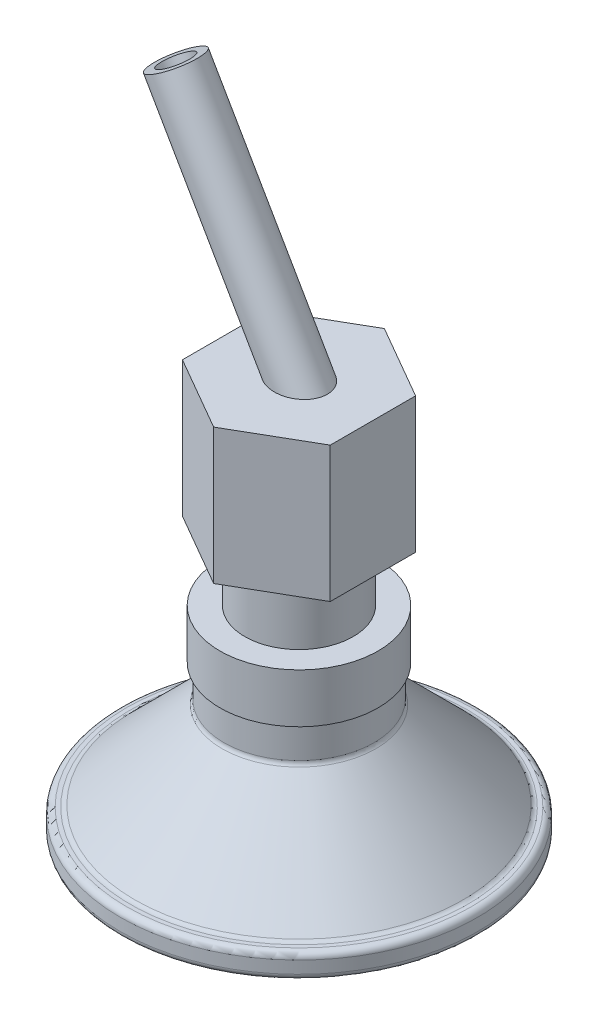
ISO-10303-21;
HEADER;
FILE_DESCRIPTION(('STEP AP214'),'2;1');
FILE_NAME('part.step','',(''),(''),'','','');
FILE_SCHEMA(('AUTOMOTIVE_DESIGN { 1 0 10303 214 1 1 1 1 }'));
ENDSEC;
DATA;
#1=APPLICATION_CONTEXT('core data for automotive mechanical design processes');
#2=APPLICATION_PROTOCOL_DEFINITION('international standard','automotive_design',2000,#1);
#3=PRODUCT_CONTEXT('',#1,'mechanical');
#4=PRODUCT('Part','Part','',(#3));
#5=PRODUCT_RELATED_PRODUCT_CATEGORY('part','',(#4));
#6=PRODUCT_DEFINITION_FORMATION('','',#4);
#7=PRODUCT_DEFINITION_CONTEXT('part definition',#1,'design');
#8=PRODUCT_DEFINITION('design','',#6,#7);
#9=PRODUCT_DEFINITION_SHAPE('','',#8);
#10=(LENGTH_UNIT() NAMED_UNIT(*) SI_UNIT(.MILLI.,.METRE.));
#11=(NAMED_UNIT(*) PLANE_ANGLE_UNIT() SI_UNIT($,.RADIAN.));
#12=(NAMED_UNIT(*) SI_UNIT($,.STERADIAN.) SOLID_ANGLE_UNIT());
#13=UNCERTAINTY_MEASURE_WITH_UNIT(LENGTH_MEASURE(1.E-05),#10,'distance_accuracy_value','');
#14=(GEOMETRIC_REPRESENTATION_CONTEXT(3) GLOBAL_UNCERTAINTY_ASSIGNED_CONTEXT((#13)) GLOBAL_UNIT_ASSIGNED_CONTEXT((#10,
#11,#12)) REPRESENTATION_CONTEXT('',''));
#15=CARTESIAN_POINT('',(0.,0.,0.));
#16=DIRECTION('',(0.,0.,1.));
#17=DIRECTION('',(1.,0.,0.));
#18=AXIS2_PLACEMENT_3D('',#15,#16,#17);
#19=CARTESIAN_POINT('',(1.49999999999998,18.5545163812393,0.));
#20=DIRECTION('',(-0.500000000000004,0.866025403784436,0.));
#21=DIRECTION('',(-0.866025403784436,-0.500000000000004,0.));
#22=AXIS2_PLACEMENT_3D('',#19,#20,#21);
#23=CYLINDRICAL_SURFACE('',#22,2.);
#24=CARTESIAN_POINT('',(1.49999999999998,18.5545163812393,0.));
#25=DIRECTION('',(-0.500000000000004,0.866025403784436,0.));
#26=DIRECTION('',(-0.866025403784436,-0.500000000000004,0.));
#27=AXIS2_PLACEMENT_3D('',#24,#25,#26);
#28=CIRCLE('',#27,2.);
#29=CARTESIAN_POINT('',(-0.232050807568896,17.5545163812393,0.));
#30=VERTEX_POINT('',#29);
#31=EDGE_CURVE('E11',#30,#30,#28,.T.);
#32=ORIENTED_EDGE('',*,*,#31,.T.);
#33=EDGE_LOOP('',(#32));
#34=FACE_BOUND('',#33,.T.);
#35=CARTESIAN_POINT('',(-10.0000000000001,38.4731006682813,0.));
#36=DIRECTION('',(-0.500000000000004,0.866025403784436,0.));
#37=DIRECTION('',(-0.866025403784436,-0.500000000000004,0.));
#38=AXIS2_PLACEMENT_3D('',#35,#36,#37);
#39=CIRCLE('',#38,2.);
#40=CARTESIAN_POINT('',(-11.732050807569,37.4731006682813,0.));
#41=VERTEX_POINT('',#40);
#42=EDGE_CURVE('E51',#41,#41,#39,.T.);
#43=ORIENTED_EDGE('',*,*,#42,.F.);
#44=EDGE_LOOP('',(#43));
#45=FACE_BOUND('',#44,.T.);
#46=ADVANCED_FACE('F41',(#34,#45),#23,.T.);
#47=CARTESIAN_POINT('',(1.49999999999998,18.5545163812393,0.));
#48=DIRECTION('',(-0.500000000000004,0.866025403784436,0.));
#49=DIRECTION('',(-0.866025403784436,-0.500000000000004,0.));
#50=AXIS2_PLACEMENT_3D('',#47,#48,#49);
#51=PLANE('',#50);
#52=CARTESIAN_POINT('',(1.49999999999998,18.5545163812393,0.));
#53=DIRECTION('',(-0.500000000000004,0.866025403784436,0.));
#54=DIRECTION('',(-0.866025403784436,-0.500000000000004,0.));
#55=AXIS2_PLACEMENT_3D('',#52,#53,#54);
#56=CIRCLE('',#55,1.3);
#57=CARTESIAN_POINT('',(0.37416697508021,17.9045163812393,0.));
#58=VERTEX_POINT('',#57);
#59=EDGE_CURVE('E47',#58,#58,#56,.T.);
#60=ORIENTED_EDGE('',*,*,#59,.T.);
#61=EDGE_LOOP('',(#60));
#62=FACE_BOUND('',#61,.T.);
#63=ORIENTED_EDGE('',*,*,#31,.F.);
#64=EDGE_LOOP('',(#63));
#65=FACE_BOUND('',#64,.T.);
#66=ADVANCED_FACE('F70',(#62,#65),#51,.F.);
#67=CARTESIAN_POINT('',(1.49999999999998,18.5545163812393,0.));
#68=DIRECTION('',(-0.500000000000004,0.866025403784436,0.));
#69=DIRECTION('',(-0.866025403784436,-0.500000000000004,0.));
#70=AXIS2_PLACEMENT_3D('',#67,#68,#69);
#71=CYLINDRICAL_SURFACE('',#70,1.3);
#72=ORIENTED_EDGE('',*,*,#59,.F.);
#73=EDGE_LOOP('',(#72));
#74=FACE_BOUND('',#73,.T.);
#75=CARTESIAN_POINT('',(-10.0000000000001,38.4731006682813,0.));
#76=DIRECTION('',(-0.500000000000004,0.866025403784436,0.));
#77=DIRECTION('',(-0.866025403784436,-0.500000000000004,0.));
#78=AXIS2_PLACEMENT_3D('',#75,#76,#77);
#79=CIRCLE('',#78,1.3);
#80=CARTESIAN_POINT('',(-11.1258330249199,37.8231006682813,0.));
#81=VERTEX_POINT('',#80);
#82=EDGE_CURVE('E55',#81,#81,#79,.T.);
#83=ORIENTED_EDGE('',*,*,#82,.T.);
#84=EDGE_LOOP('',(#83));
#85=FACE_BOUND('',#84,.T.);
#86=ADVANCED_FACE('F61',(#74,#85),#71,.F.);
#87=CARTESIAN_POINT('',(-10.0000000000001,38.4731006682813,0.));
#88=DIRECTION('',(-0.500000000000004,0.866025403784436,0.));
#89=DIRECTION('',(-0.866025403784436,-0.500000000000004,0.));
#90=AXIS2_PLACEMENT_3D('',#87,#88,#89);
#91=PLANE('',#90);
#92=ORIENTED_EDGE('',*,*,#42,.T.);
#93=EDGE_LOOP('',(#92));
#94=FACE_BOUND('',#93,.T.);
#95=ORIENTED_EDGE('',*,*,#82,.F.);
#96=EDGE_LOOP('',(#95));
#97=FACE_BOUND('',#96,.T.);
#98=ADVANCED_FACE('F63',(#94,#97),#91,.T.);
#99=CLOSED_SHELL('',(#46,#66,#86,#98));
#100=MANIFOLD_SOLID_BREP('B2',#99);
#101=CARTESIAN_POINT('',(5.1,1.15259259259259,0.));
#102=DIRECTION('',(0.,-1.,0.));
#103=DIRECTION('',(0.,0.,-1.));
#104=AXIS2_PLACEMENT_3D('',#101,#102,#103);
#105=PLANE('',#104);
#106=CARTESIAN_POINT('',(0.,1.15259259259259,0.));
#107=DIRECTION('',(0.,1.,0.));
#108=DIRECTION('',(0.,0.,1.));
#109=AXIS2_PLACEMENT_3D('',#106,#107,#108);
#110=CIRCLE('',#109,5.1);
#111=CARTESIAN_POINT('',(0.,1.15259259259259,5.1));
#112=VERTEX_POINT('',#111);
#113=EDGE_CURVE('E158',#112,#112,#110,.T.);
#114=ORIENTED_EDGE('',*,*,#113,.F.);
#115=EDGE_LOOP('',(#114));
#116=FACE_BOUND('',#115,.T.);
#117=CARTESIAN_POINT('',(0.,1.15259259259259,0.));
#118=DIRECTION('',(0.,1.,0.));
#119=DIRECTION('',(0.,0.,1.));
#120=AXIS2_PLACEMENT_3D('',#117,#118,#119);
#121=CIRCLE('',#120,6.1);
#122=CARTESIAN_POINT('',(0.,1.15259259259259,6.1));
#123=VERTEX_POINT('',#122);
#124=EDGE_CURVE('E143',#123,#123,#121,.T.);
#125=ORIENTED_EDGE('',*,*,#124,.T.);
#126=EDGE_LOOP('',(#125));
#127=FACE_BOUND('',#126,.T.);
#128=ADVANCED_FACE('F111',(#116,#127),#105,.F.);
#129=CARTESIAN_POINT('',(0.,10.1525925925926,0.));
#130=DIRECTION('',(0.,1.,0.));
#131=DIRECTION('',(0.,0.,1.));
#132=AXIS2_PLACEMENT_3D('',#129,#130,#131);
#133=CYLINDRICAL_SURFACE('',#132,6.1);
#134=CARTESIAN_POINT('',(0.,-1.45244442794756,0.));
#135=DIRECTION('',(0.,1.,0.));
#136=DIRECTION('',(0.,0.,1.));
#137=AXIS2_PLACEMENT_3D('',#134,#135,#136);
#138=CIRCLE('',#137,6.1);
#139=CARTESIAN_POINT('',(0.,-1.45244442794756,6.1));
#140=VERTEX_POINT('',#139);
#141=EDGE_CURVE('E126',#140,#140,#138,.T.);
#142=ORIENTED_EDGE('',*,*,#141,.T.);
#143=EDGE_LOOP('',(#142));
#144=FACE_BOUND('',#143,.T.);
#145=ORIENTED_EDGE('',*,*,#124,.F.);
#146=EDGE_LOOP('',(#145));
#147=FACE_BOUND('',#146,.T.);
#148=ADVANCED_FACE('F166',(#144,#147),#133,.T.);
#149=CARTESIAN_POINT('',(0.,-9.0358179512275,0.));
#150=DIRECTION('',(0.,-1.,0.));
#151=DIRECTION('',(0.,0.,-1.));
#152=AXIS2_PLACEMENT_3D('',#149,#150,#151);
#153=CONICAL_SURFACE('',#152,13.4762667420934,0.785398163397448);
#154=CARTESIAN_POINT('',(0.,-8.88937134182077,0.));
#155=DIRECTION('',(0.,-1.,0.));
#156=DIRECTION('',(0.,0.,-1.));
#157=AXIS2_PLACEMENT_3D('',#154,#155,#156);
#158=CIRCLE('',#157,13.3298201326867);
#159=CARTESIAN_POINT('',(0.,-8.88937134182077,-13.3298201326867));
#160=VERTEX_POINT('',#159);
#161=EDGE_CURVE('E137',#160,#160,#158,.F.);
#162=ORIENTED_EDGE('',*,*,#161,.T.);
#163=EDGE_LOOP('',(#162));
#164=FACE_BOUND('',#163,.T.);
#165=CARTESIAN_POINT('',(0.,-1.80599781854084,0.));
#166=DIRECTION('',(0.,-1.,0.));
#167=DIRECTION('',(0.,0.,-1.));
#168=AXIS2_PLACEMENT_3D('',#165,#166,#167);
#169=CIRCLE('',#168,6.24644660940673);
#170=CARTESIAN_POINT('',(0.,-1.80599781854084,-6.24644660940673));
#171=VERTEX_POINT('',#170);
#172=EDGE_CURVE('E140',#171,#171,#169,.T.);
#173=ORIENTED_EDGE('',*,*,#172,.T.);
#174=EDGE_LOOP('',(#173));
#175=FACE_BOUND('',#174,.T.);
#176=ADVANCED_FACE('F171',(#164,#175),#153,.T.);
#177=CARTESIAN_POINT('',(13.4762667420934,-9.03581795122749,0.));
#178=DIRECTION('',(0.,-1.,0.));
#179=DIRECTION('',(0.,0.,-1.));
#180=AXIS2_PLACEMENT_3D('',#177,#178,#179);
#181=PLANE('',#180);
#182=CARTESIAN_POINT('',(0.,-9.03581795122749,0.));
#183=DIRECTION('',(0.,-1.,0.));
#184=DIRECTION('',(0.,0.,-1.));
#185=AXIS2_PLACEMENT_3D('',#182,#183,#184);
#186=CIRCLE('',#185,13.6833735232799);
#187=CARTESIAN_POINT('',(0.,-9.03581795122749,-13.6833735232799));
#188=VERTEX_POINT('',#187);
#189=EDGE_CURVE('E131',#188,#188,#186,.T.);
#190=ORIENTED_EDGE('',*,*,#189,.T.);
#191=EDGE_LOOP('',(#190));
#192=FACE_BOUND('',#191,.T.);
#193=CARTESIAN_POINT('',(0.,-9.03581795122749,0.));
#194=DIRECTION('',(0.,-1.,0.));
#195=DIRECTION('',(0.,0.,-1.));
#196=AXIS2_PLACEMENT_3D('',#193,#194,#195);
#197=CIRCLE('',#196,14.000695366395);
#198=CARTESIAN_POINT('',(0.,-9.03581795122749,-14.000695366395));
#199=VERTEX_POINT('',#198);
#200=EDGE_CURVE('E134',#199,#199,#197,.F.);
#201=ORIENTED_EDGE('',*,*,#200,.T.);
#202=EDGE_LOOP('',(#201));
#203=FACE_BOUND('',#202,.T.);
#204=ADVANCED_FACE('F177',(#192,#203),#181,.F.);
#205=CARTESIAN_POINT('',(0.,10.1525925925926,0.));
#206=DIRECTION('',(0.,1.,0.));
#207=DIRECTION('',(0.,0.,1.));
#208=AXIS2_PLACEMENT_3D('',#205,#206,#207);
#209=CYLINDRICAL_SURFACE('',#208,14.500695366395);
#210=CARTESIAN_POINT('',(0.,-10.5358179512275,0.));
#211=DIRECTION('',(0.,1.,0.));
#212=DIRECTION('',(0.,0.,1.));
#213=AXIS2_PLACEMENT_3D('',#210,#211,#212);
#214=CIRCLE('',#213,14.500695366395);
#215=CARTESIAN_POINT('',(0.,-10.5358179512275,14.500695366395));
#216=VERTEX_POINT('',#215);
#217=EDGE_CURVE('E118',#216,#216,#214,.T.);
#218=ORIENTED_EDGE('',*,*,#217,.T.);
#219=EDGE_LOOP('',(#218));
#220=FACE_BOUND('',#219,.T.);
#221=CARTESIAN_POINT('',(0.,-9.53581795122749,0.));
#222=DIRECTION('',(0.,-1.,0.));
#223=DIRECTION('',(0.,0.,-1.));
#224=AXIS2_PLACEMENT_3D('',#221,#222,#223);
#225=CIRCLE('',#224,14.500695366395);
#226=CARTESIAN_POINT('',(0.,-9.53581795122749,-14.500695366395));
#227=VERTEX_POINT('',#226);
#228=EDGE_CURVE('E122',#227,#227,#225,.T.);
#229=ORIENTED_EDGE('',*,*,#228,.T.);
#230=EDGE_LOOP('',(#229));
#231=FACE_BOUND('',#230,.T.);
#232=ADVANCED_FACE('F204',(#220,#231),#209,.T.);
#233=CARTESIAN_POINT('',(14.500695366395,-11.0358179512275,0.));
#234=DIRECTION('',(0.,1.,0.));
#235=DIRECTION('',(0.,0.,1.));
#236=AXIS2_PLACEMENT_3D('',#233,#234,#235);
#237=PLANE('',#236);
#238=CARTESIAN_POINT('',(0.,-11.0358179512275,0.));
#239=DIRECTION('',(0.,1.,0.));
#240=DIRECTION('',(0.,0.,1.));
#241=AXIS2_PLACEMENT_3D('',#238,#239,#240);
#242=CIRCLE('',#241,14.000695366395);
#243=CARTESIAN_POINT('',(0.,-11.0358179512275,14.000695366395));
#244=VERTEX_POINT('',#243);
#245=EDGE_CURVE('E40',#244,#244,#242,.F.);
#246=ORIENTED_EDGE('',*,*,#245,.T.);
#247=EDGE_LOOP('',(#246));
#248=FACE_BOUND('',#247,.T.);
#249=CARTESIAN_POINT('',(0.,-11.0358179512275,0.));
#250=DIRECTION('',(0.,1.,0.));
#251=DIRECTION('',(0.,0.,1.));
#252=AXIS2_PLACEMENT_3D('',#249,#250,#251);
#253=CIRCLE('',#252,6.59139488632843);
#254=CARTESIAN_POINT('',(0.,-11.0358179512275,6.59139488632843));
#255=VERTEX_POINT('',#254);
#256=EDGE_CURVE('E146',#255,#255,#253,.T.);
#257=ORIENTED_EDGE('',*,*,#256,.T.);
#258=EDGE_LOOP('',(#257));
#259=FACE_BOUND('',#258,.T.);
#260=ADVANCED_FACE('F209',(#248,#259),#237,.F.);
#261=CARTESIAN_POINT('',(0.,10.1525925925926,0.));
#262=DIRECTION('',(0.,1.,0.));
#263=DIRECTION('',(0.,0.,1.));
#264=AXIS2_PLACEMENT_3D('',#261,#262,#263);
#265=CYLINDRICAL_SURFACE('',#264,6.59139488632843);
#266=ORIENTED_EDGE('',*,*,#256,.F.);
#267=EDGE_LOOP('',(#266));
#268=FACE_BOUND('',#267,.T.);
#269=CARTESIAN_POINT('',(0.,-9.03581795122749,0.));
#270=DIRECTION('',(0.,1.,0.));
#271=DIRECTION('',(0.,0.,1.));
#272=AXIS2_PLACEMENT_3D('',#269,#270,#271);
#273=CIRCLE('',#272,6.59139488632843);
#274=CARTESIAN_POINT('',(0.,-9.03581795122749,6.59139488632843));
#275=VERTEX_POINT('',#274);
#276=EDGE_CURVE('E149',#275,#275,#273,.T.);
#277=ORIENTED_EDGE('',*,*,#276,.T.);
#278=EDGE_LOOP('',(#277));
#279=FACE_BOUND('',#278,.T.);
#280=ADVANCED_FACE('F214',(#268,#279),#265,.F.);
#281=CARTESIAN_POINT('',(6.59139488632843,-9.03581795122749,0.));
#282=DIRECTION('',(0.,-1.,0.));
#283=DIRECTION('',(0.,0.,-1.));
#284=AXIS2_PLACEMENT_3D('',#281,#282,#283);
#285=PLANE('',#284);
#286=ORIENTED_EDGE('',*,*,#276,.F.);
#287=EDGE_LOOP('',(#286));
#288=FACE_BOUND('',#287,.T.);
#289=CARTESIAN_POINT('',(0.,-9.03581795122749,0.));
#290=DIRECTION('',(0.,1.,0.));
#291=DIRECTION('',(0.,0.,1.));
#292=AXIS2_PLACEMENT_3D('',#289,#290,#291);
#293=CIRCLE('',#292,12.0620531797203);
#294=CARTESIAN_POINT('',(0.,-9.03581795122749,12.0620531797203));
#295=VERTEX_POINT('',#294);
#296=EDGE_CURVE('E152',#295,#295,#293,.T.);
#297=ORIENTED_EDGE('',*,*,#296,.T.);
#298=EDGE_LOOP('',(#297));
#299=FACE_BOUND('',#298,.T.);
#300=ADVANCED_FACE('F217',(#288,#299),#285,.F.);
#301=CARTESIAN_POINT('',(0.,-2.0737647715072,0.));
#302=DIRECTION('',(0.,-1.,0.));
#303=DIRECTION('',(0.,0.,-1.));
#304=AXIS2_PLACEMENT_3D('',#301,#302,#303);
#305=CONICAL_SURFACE('',#304,5.1,0.785398163397448);
#306=ORIENTED_EDGE('',*,*,#296,.F.);
#307=EDGE_LOOP('',(#306));
#308=FACE_BOUND('',#307,.T.);
#309=CARTESIAN_POINT('',(0.,-2.0737647715072,0.));
#310=DIRECTION('',(0.,1.,0.));
#311=DIRECTION('',(0.,0.,1.));
#312=AXIS2_PLACEMENT_3D('',#309,#310,#311);
#313=CIRCLE('',#312,5.1);
#314=CARTESIAN_POINT('',(0.,-2.0737647715072,5.1));
#315=VERTEX_POINT('',#314);
#316=EDGE_CURVE('E155',#315,#315,#313,.T.);
#317=ORIENTED_EDGE('',*,*,#316,.T.);
#318=EDGE_LOOP('',(#317));
#319=FACE_BOUND('',#318,.T.);
#320=ADVANCED_FACE('F221',(#308,#319),#305,.F.);
#321=CARTESIAN_POINT('',(0.,10.1525925925926,0.));
#322=DIRECTION('',(0.,1.,0.));
#323=DIRECTION('',(0.,0.,1.));
#324=AXIS2_PLACEMENT_3D('',#321,#322,#323);
#325=CYLINDRICAL_SURFACE('',#324,5.1);
#326=ORIENTED_EDGE('',*,*,#316,.F.);
#327=EDGE_LOOP('',(#326));
#328=FACE_BOUND('',#327,.T.);
#329=ORIENTED_EDGE('',*,*,#113,.T.);
#330=EDGE_LOOP('',(#329));
#331=FACE_BOUND('',#330,.T.);
#332=ADVANCED_FACE('F162',(#328,#331),#325,.F.);
#333=CARTESIAN_POINT('',(0.,-8.53581795122749,0.));
#334=DIRECTION('',(0.,-1.,0.));
#335=DIRECTION('',(0.,0.,-1.));
#336=AXIS2_PLACEMENT_3D('',#333,#334,#335);
#337=TOROIDAL_SURFACE('',#336,13.6833735232799,0.5);
#338=ORIENTED_EDGE('',*,*,#189,.F.);
#339=EDGE_LOOP('',(#338));
#340=FACE_BOUND('',#339,.T.);
#341=ORIENTED_EDGE('',*,*,#161,.F.);
#342=EDGE_LOOP('',(#341));
#343=FACE_BOUND('',#342,.T.);
#344=ADVANCED_FACE('F182',(#340,#343),#337,.F.);
#345=CARTESIAN_POINT('',(0.,-1.45244442794756,0.));
#346=DIRECTION('',(0.,1.,0.));
#347=DIRECTION('',(0.,0.,1.));
#348=AXIS2_PLACEMENT_3D('',#345,#346,#347);
#349=TOROIDAL_SURFACE('',#348,6.6,0.5);
#350=ORIENTED_EDGE('',*,*,#172,.F.);
#351=EDGE_LOOP('',(#350));
#352=FACE_BOUND('',#351,.T.);
#353=ORIENTED_EDGE('',*,*,#141,.F.);
#354=EDGE_LOOP('',(#353));
#355=FACE_BOUND('',#354,.T.);
#356=ADVANCED_FACE('F185',(#352,#355),#349,.F.);
#357=CARTESIAN_POINT('',(0.,-10.5358179512275,0.));
#358=DIRECTION('',(0.,1.,0.));
#359=DIRECTION('',(0.,0.,1.));
#360=AXIS2_PLACEMENT_3D('',#357,#358,#359);
#361=TOROIDAL_SURFACE('',#360,14.000695366395,0.5);
#362=ORIENTED_EDGE('',*,*,#245,.F.);
#363=EDGE_LOOP('',(#362));
#364=FACE_BOUND('',#363,.T.);
#365=ORIENTED_EDGE('',*,*,#217,.F.);
#366=EDGE_LOOP('',(#365));
#367=FACE_BOUND('',#366,.T.);
#368=ADVANCED_FACE('F188',(#364,#367),#361,.T.);
#369=CARTESIAN_POINT('',(0.,-9.53581795122749,0.));
#370=DIRECTION('',(0.,-1.,0.));
#371=DIRECTION('',(0.,0.,-1.));
#372=AXIS2_PLACEMENT_3D('',#369,#370,#371);
#373=TOROIDAL_SURFACE('',#372,14.000695366395,0.5);
#374=ORIENTED_EDGE('',*,*,#228,.F.);
#375=EDGE_LOOP('',(#374));
#376=FACE_BOUND('',#375,.T.);
#377=ORIENTED_EDGE('',*,*,#200,.F.);
#378=EDGE_LOOP('',(#377));
#379=FACE_BOUND('',#378,.T.);
#380=ADVANCED_FACE('F113',(#376,#379),#373,.T.);
#381=CLOSED_SHELL('',(#128,#148,#176,#204,#232,#260,#280,#300,#320,#332,#344,#356,#368,#380));
#382=MANIFOLD_SOLID_BREP('B6',#381);
#383=CARTESIAN_POINT('',(0.,1.89851851851856,0.));
#384=DIRECTION('',(0.,-1.,0.));
#385=DIRECTION('',(0.,0.,-1.));
#386=AXIS2_PLACEMENT_3D('',#383,#384,#385);
#387=CYLINDRICAL_SURFACE('',#386,2.);
#388=CARTESIAN_POINT('',(0.,1.15259259259258,0.));
#389=DIRECTION('',(0.,-1.,0.));
#390=DIRECTION('',(0.,0.,-1.));
#391=AXIS2_PLACEMENT_3D('',#388,#389,#390);
#392=CIRCLE('',#391,2.);
#393=CARTESIAN_POINT('',(0.,1.15259259259258,-2.));
#394=VERTEX_POINT('',#393);
#395=EDGE_CURVE('E109',#394,#394,#392,.T.);
#396=ORIENTED_EDGE('',*,*,#395,.T.);
#397=EDGE_LOOP('',(#396));
#398=FACE_BOUND('',#397,.T.);
#399=CARTESIAN_POINT('',(0.,21.1525925925926,0.));
#400=DIRECTION('',(0.,1.,0.));
#401=DIRECTION('',(0.,0.,1.));
#402=AXIS2_PLACEMENT_3D('',#399,#400,#401);
#403=CIRCLE('',#402,2.);
#404=CARTESIAN_POINT('',(0.,21.1525925925926,2.));
#405=VERTEX_POINT('',#404);
#406=EDGE_CURVE('E412',#405,#405,#403,.T.);
#407=ORIENTED_EDGE('',*,*,#406,.T.);
#408=EDGE_LOOP('',(#407));
#409=FACE_BOUND('',#408,.T.);
#410=ADVANCED_FACE('F322',(#398,#409),#387,.F.);
#411=CARTESIAN_POINT('',(6.42074074074074,1.15259259259258,0.));
#412=DIRECTION('',(0.,-1.,0.));
#413=DIRECTION('',(0.,0.,-1.));
#414=AXIS2_PLACEMENT_3D('',#411,#412,#413);
#415=PLANE('',#414);
#416=CARTESIAN_POINT('',(0.,1.15259259259258,0.));
#417=DIRECTION('',(0.,-1.,0.));
#418=DIRECTION('',(0.,0.,-1.));
#419=AXIS2_PLACEMENT_3D('',#416,#417,#418);
#420=CIRCLE('',#419,6.42074074074074);
#421=CARTESIAN_POINT('',(0.,1.15259259259258,-6.42074074074074));
#422=VERTEX_POINT('',#421);
#423=EDGE_CURVE('E330',#422,#422,#420,.T.);
#424=ORIENTED_EDGE('',*,*,#423,.T.);
#425=EDGE_LOOP('',(#424));
#426=FACE_BOUND('',#425,.T.);
#427=ORIENTED_EDGE('',*,*,#395,.F.);
#428=EDGE_LOOP('',(#427));
#429=FACE_BOUND('',#428,.T.);
#430=ADVANCED_FACE('F439',(#426,#429),#415,.T.);
#431=CARTESIAN_POINT('',(0.,1.89851851851856,0.));
#432=DIRECTION('',(0.,-1.,0.));
#433=DIRECTION('',(0.,0.,-1.));
#434=AXIS2_PLACEMENT_3D('',#431,#432,#433);
#435=CYLINDRICAL_SURFACE('',#434,6.42074074074074);
#436=CARTESIAN_POINT('',(0.,5.15259259259258,0.));
#437=DIRECTION('',(0.,-1.,0.));
#438=DIRECTION('',(0.,0.,-1.));
#439=AXIS2_PLACEMENT_3D('',#436,#437,#438);
#440=CIRCLE('',#439,6.42074074074074);
#441=CARTESIAN_POINT('',(0.,5.15259259259258,-6.42074074074074));
#442=VERTEX_POINT('',#441);
#443=EDGE_CURVE('E434',#442,#442,#440,.T.);
#444=ORIENTED_EDGE('',*,*,#443,.T.);
#445=EDGE_LOOP('',(#444));
#446=FACE_BOUND('',#445,.T.);
#447=ORIENTED_EDGE('',*,*,#423,.F.);
#448=EDGE_LOOP('',(#447));
#449=FACE_BOUND('',#448,.T.);
#450=ADVANCED_FACE('F442',(#446,#449),#435,.T.);
#451=CARTESIAN_POINT('',(4.4,5.15259259259258,0.));
#452=DIRECTION('',(0.,1.,0.));
#453=DIRECTION('',(0.,0.,1.));
#454=AXIS2_PLACEMENT_3D('',#451,#452,#453);
#455=PLANE('',#454);
#456=CARTESIAN_POINT('',(0.,5.15259259259258,0.));
#457=DIRECTION('',(0.,-1.,0.));
#458=DIRECTION('',(0.,0.,-1.));
#459=AXIS2_PLACEMENT_3D('',#456,#457,#458);
#460=CIRCLE('',#459,4.4);
#461=CARTESIAN_POINT('',(0.,5.15259259259258,-4.4));
#462=VERTEX_POINT('',#461);
#463=EDGE_CURVE('E431',#462,#462,#460,.T.);
#464=ORIENTED_EDGE('',*,*,#463,.T.);
#465=EDGE_LOOP('',(#464));
#466=FACE_BOUND('',#465,.T.);
#467=ORIENTED_EDGE('',*,*,#443,.F.);
#468=EDGE_LOOP('',(#467));
#469=FACE_BOUND('',#468,.T.);
#470=ADVANCED_FACE('F444',(#466,#469),#455,.T.);
#471=CARTESIAN_POINT('',(0.,1.89851851851856,0.));
#472=DIRECTION('',(0.,-1.,0.));
#473=DIRECTION('',(0.,0.,-1.));
#474=AXIS2_PLACEMENT_3D('',#471,#472,#473);
#475=CYLINDRICAL_SURFACE('',#474,4.4);
#476=CARTESIAN_POINT('',(0.,10.1525925925926,0.));
#477=DIRECTION('',(0.,-1.,0.));
#478=DIRECTION('',(0.,0.,-1.));
#479=AXIS2_PLACEMENT_3D('',#476,#477,#478);
#480=CIRCLE('',#479,4.4);
#481=CARTESIAN_POINT('',(0.,10.1525925925926,-4.4));
#482=VERTEX_POINT('',#481);
#483=EDGE_CURVE('E428',#482,#482,#480,.T.);
#484=ORIENTED_EDGE('',*,*,#483,.T.);
#485=EDGE_LOOP('',(#484));
#486=FACE_BOUND('',#485,.T.);
#487=ORIENTED_EDGE('',*,*,#463,.F.);
#488=EDGE_LOOP('',(#487));
#489=FACE_BOUND('',#488,.T.);
#490=ADVANCED_FACE('F451',(#486,#489),#475,.T.);
#491=CARTESIAN_POINT('',(0.,21.1525925925926,0.));
#492=DIRECTION('',(0.,1.,0.));
#493=DIRECTION('',(0.,0.,1.));
#494=AXIS2_PLACEMENT_3D('',#491,#492,#493);
#495=PLANE('',#494);
#496=DIRECTION('',(0.,0.,-1.));
#497=VECTOR('',#496,1.);
#498=CARTESIAN_POINT('',(5.99999999999998,21.1525925925926,3.46410161513779));
#499=LINE('',#498,#497);
#500=CARTESIAN_POINT('',(5.99999999999998,21.1525925925926,3.46410161513779));
#501=VERTEX_POINT('',#500);
#502=CARTESIAN_POINT('',(6.00000000000002,21.1525925925926,-3.46410161513772));
#503=VERTEX_POINT('',#502);
#504=EDGE_CURVE('E419',#501,#503,#499,.T.);
#505=ORIENTED_EDGE('',*,*,#504,.T.);
#506=DIRECTION('',(-0.866025403784436,0.,-0.500000000000005));
#507=VECTOR('',#506,1.);
#508=CARTESIAN_POINT('',(6.00000000000002,21.1525925925926,-3.46410161513772));
#509=LINE('',#508,#507);
#510=CARTESIAN_POINT('',(0.,21.1525925925926,-6.92820323027551));
#511=VERTEX_POINT('',#510);
#512=EDGE_CURVE('E376',#503,#511,#509,.T.);
#513=ORIENTED_EDGE('',*,*,#512,.T.);
#514=DIRECTION('',(-0.866025403784442,0.,0.499999999999995));
#515=VECTOR('',#514,1.);
#516=CARTESIAN_POINT('',(0.,21.1525925925926,-6.92820323027551));
#517=LINE('',#516,#515);
#518=CARTESIAN_POINT('',(-5.99999999999998,21.1525925925926,-3.46410161513779));
#519=VERTEX_POINT('',#518);
#520=EDGE_CURVE('E390',#511,#519,#517,.T.);
#521=ORIENTED_EDGE('',*,*,#520,.T.);
#522=DIRECTION('',(0.,0.,1.));
#523=VECTOR('',#522,1.);
#524=CARTESIAN_POINT('',(-5.99999999999998,21.1525925925926,-3.46410161513779));
#525=LINE('',#524,#523);
#526=CARTESIAN_POINT('',(-6.00000000000002,21.1525925925926,3.46410161513772));
#527=VERTEX_POINT('',#526);
#528=EDGE_CURVE('E383',#519,#527,#525,.T.);
#529=ORIENTED_EDGE('',*,*,#528,.T.);
#530=DIRECTION('',(0.866025403784436,0.,0.500000000000005));
#531=VECTOR('',#530,1.);
#532=CARTESIAN_POINT('',(-6.00000000000002,21.1525925925926,3.46410161513772));
#533=LINE('',#532,#531);
#534=CARTESIAN_POINT('',(0.,21.1525925925926,6.92820323027551));
#535=VERTEX_POINT('',#534);
#536=EDGE_CURVE('E388',#527,#535,#533,.T.);
#537=ORIENTED_EDGE('',*,*,#536,.T.);
#538=DIRECTION('',(0.866025403784441,0.,-0.499999999999995));
#539=VECTOR('',#538,1.);
#540=CARTESIAN_POINT('',(0.,21.1525925925926,6.92820323027551));
#541=LINE('',#540,#539);
#542=EDGE_CURVE('E338',#535,#501,#541,.T.);
#543=ORIENTED_EDGE('',*,*,#542,.T.);
#544=EDGE_LOOP('',(#505,#513,#521,#529,#537,#543));
#545=FACE_BOUND('',#544,.T.);
#546=ORIENTED_EDGE('',*,*,#406,.F.);
#547=EDGE_LOOP('',(#546));
#548=FACE_BOUND('',#547,.T.);
#549=ADVANCED_FACE('F385',(#545,#548),#495,.T.);
#550=CARTESIAN_POINT('',(0.,10.1525925925926,0.));
#551=DIRECTION('',(0.,1.,0.));
#552=DIRECTION('',(0.,0.,1.));
#553=AXIS2_PLACEMENT_3D('',#550,#551,#552);
#554=PLANE('',#553);
#555=ORIENTED_EDGE('',*,*,#483,.F.);
#556=EDGE_LOOP('',(#555));
#557=FACE_BOUND('',#556,.T.);
#558=DIRECTION('',(0.,0.,-1.));
#559=VECTOR('',#558,1.);
#560=CARTESIAN_POINT('',(5.99999999999998,10.1525925925926,3.46410161513779));
#561=LINE('',#560,#559);
#562=CARTESIAN_POINT('',(5.99999999999998,10.1525925925926,3.46410161513779));
#563=VERTEX_POINT('',#562);
#564=CARTESIAN_POINT('',(6.00000000000002,10.1525925925926,-3.46410161513772));
#565=VERTEX_POINT('',#564);
#566=EDGE_CURVE('E408',#563,#565,#561,.T.);
#567=ORIENTED_EDGE('',*,*,#566,.F.);
#568=DIRECTION('',(0.866025403784441,0.,-0.499999999999995));
#569=VECTOR('',#568,1.);
#570=CARTESIAN_POINT('',(0.,10.1525925925926,6.92820323027551));
#571=LINE('',#570,#569);
#572=CARTESIAN_POINT('',(0.,10.1525925925926,6.92820323027551));
#573=VERTEX_POINT('',#572);
#574=EDGE_CURVE('E367',#573,#563,#571,.T.);
#575=ORIENTED_EDGE('',*,*,#574,.F.);
#576=DIRECTION('',(0.866025403784436,0.,0.500000000000005));
#577=VECTOR('',#576,1.);
#578=CARTESIAN_POINT('',(-6.00000000000002,10.1525925925926,3.46410161513772));
#579=LINE('',#578,#577);
#580=CARTESIAN_POINT('',(-6.00000000000002,10.1525925925926,3.46410161513772));
#581=VERTEX_POINT('',#580);
#582=EDGE_CURVE('E361',#581,#573,#579,.T.);
#583=ORIENTED_EDGE('',*,*,#582,.F.);
#584=DIRECTION('',(0.,0.,1.));
#585=VECTOR('',#584,1.);
#586=CARTESIAN_POINT('',(-5.99999999999998,10.1525925925926,-3.46410161513779));
#587=LINE('',#586,#585);
#588=CARTESIAN_POINT('',(-5.99999999999998,10.1525925925926,-3.46410161513779));
#589=VERTEX_POINT('',#588);
#590=EDGE_CURVE('E398',#589,#581,#587,.T.);
#591=ORIENTED_EDGE('',*,*,#590,.F.);
#592=DIRECTION('',(-0.866025403784442,0.,0.499999999999995));
#593=VECTOR('',#592,1.);
#594=CARTESIAN_POINT('',(0.,10.1525925925926,-6.92820323027551));
#595=LINE('',#594,#593);
#596=CARTESIAN_POINT('',(0.,10.1525925925926,-6.92820323027551));
#597=VERTEX_POINT('',#596);
#598=EDGE_CURVE('E414',#597,#589,#595,.T.);
#599=ORIENTED_EDGE('',*,*,#598,.F.);
#600=DIRECTION('',(-0.866025403784436,0.,-0.500000000000005));
#601=VECTOR('',#600,1.);
#602=CARTESIAN_POINT('',(6.00000000000002,10.1525925925926,-3.46410161513772));
#603=LINE('',#602,#601);
#604=EDGE_CURVE('E411',#565,#597,#603,.T.);
#605=ORIENTED_EDGE('',*,*,#604,.F.);
#606=EDGE_LOOP('',(#567,#575,#583,#591,#599,#605));
#607=FACE_BOUND('',#606,.T.);
#608=ADVANCED_FACE('F473',(#557,#607),#554,.F.);
#609=CARTESIAN_POINT('',(5.99999999999998,21.1525925925926,3.46410161513779));
#610=DIRECTION('',(-1.,0.,0.));
#611=DIRECTION('',(0.,0.,1.));
#612=AXIS2_PLACEMENT_3D('',#609,#610,#611);
#613=PLANE('',#612);
#614=ORIENTED_EDGE('',*,*,#566,.T.);
#615=DIRECTION('',(0.,-1.,0.));
#616=VECTOR('',#615,1.);
#617=CARTESIAN_POINT('',(6.00000000000002,21.1525925925926,-3.46410161513772));
#618=LINE('',#617,#616);
#619=EDGE_CURVE('E426',#503,#565,#618,.T.);
#620=ORIENTED_EDGE('',*,*,#619,.F.);
#621=ORIENTED_EDGE('',*,*,#504,.F.);
#622=DIRECTION('',(0.,-1.,0.));
#623=VECTOR('',#622,1.);
#624=CARTESIAN_POINT('',(5.99999999999998,21.1525925925926,3.46410161513779));
#625=LINE('',#624,#623);
#626=EDGE_CURVE('E404',#501,#563,#625,.T.);
#627=ORIENTED_EDGE('',*,*,#626,.T.);
#628=EDGE_LOOP('',(#614,#620,#621,#627));
#629=FACE_BOUND('',#628,.T.);
#630=ADVANCED_FACE('F475',(#629),#613,.F.);
#631=CARTESIAN_POINT('',(6.00000000000002,21.1525925925926,-3.46410161513772));
#632=DIRECTION('',(-0.500000000000005,0.,0.866025403784436));
#633=DIRECTION('',(0.866025403784436,0.,0.500000000000005));
#634=AXIS2_PLACEMENT_3D('',#631,#632,#633);
#635=PLANE('',#634);
#636=ORIENTED_EDGE('',*,*,#604,.T.);
#637=DIRECTION('',(0.,-1.,0.));
#638=VECTOR('',#637,1.);
#639=CARTESIAN_POINT('',(0.,21.1525925925926,-6.92820323027551));
#640=LINE('',#639,#638);
#641=EDGE_CURVE('E423',#511,#597,#640,.T.);
#642=ORIENTED_EDGE('',*,*,#641,.F.);
#643=ORIENTED_EDGE('',*,*,#512,.F.);
#644=ORIENTED_EDGE('',*,*,#619,.T.);
#645=EDGE_LOOP('',(#636,#642,#643,#644));
#646=FACE_BOUND('',#645,.T.);
#647=ADVANCED_FACE('F467',(#646),#635,.F.);
#648=CARTESIAN_POINT('',(0.,21.1525925925926,-6.92820323027551));
#649=DIRECTION('',(0.499999999999995,0.,0.866025403784442));
#650=DIRECTION('',(0.866025403784441,0.,-0.499999999999995));
#651=AXIS2_PLACEMENT_3D('',#648,#649,#650);
#652=PLANE('',#651);
#653=ORIENTED_EDGE('',*,*,#598,.T.);
#654=DIRECTION('',(0.,-1.,0.));
#655=VECTOR('',#654,1.);
#656=CARTESIAN_POINT('',(-5.99999999999998,21.1525925925926,-3.46410161513779));
#657=LINE('',#656,#655);
#658=EDGE_CURVE('E399',#519,#589,#657,.T.);
#659=ORIENTED_EDGE('',*,*,#658,.F.);
#660=ORIENTED_EDGE('',*,*,#520,.F.);
#661=ORIENTED_EDGE('',*,*,#641,.T.);
#662=EDGE_LOOP('',(#653,#659,#660,#661));
#663=FACE_BOUND('',#662,.T.);
#664=ADVANCED_FACE('F470',(#663),#652,.F.);
#665=CARTESIAN_POINT('',(-5.99999999999998,21.1525925925926,-3.46410161513779));
#666=DIRECTION('',(1.,0.,0.));
#667=DIRECTION('',(0.,0.,-1.));
#668=AXIS2_PLACEMENT_3D('',#665,#666,#667);
#669=PLANE('',#668);
#670=ORIENTED_EDGE('',*,*,#590,.T.);
#671=DIRECTION('',(0.,-1.,0.));
#672=VECTOR('',#671,1.);
#673=CARTESIAN_POINT('',(-6.00000000000002,21.1525925925926,3.46410161513772));
#674=LINE('',#673,#672);
#675=EDGE_CURVE('E395',#527,#581,#674,.T.);
#676=ORIENTED_EDGE('',*,*,#675,.F.);
#677=ORIENTED_EDGE('',*,*,#528,.F.);
#678=ORIENTED_EDGE('',*,*,#658,.T.);
#679=EDGE_LOOP('',(#670,#676,#677,#678));
#680=FACE_BOUND('',#679,.T.);
#681=ADVANCED_FACE('F396',(#680),#669,.F.);
#682=CARTESIAN_POINT('',(-6.00000000000002,21.1525925925926,3.46410161513772));
#683=DIRECTION('',(0.500000000000005,0.,-0.866025403784436));
#684=DIRECTION('',(-0.866025403784436,0.,-0.500000000000005));
#685=AXIS2_PLACEMENT_3D('',#682,#683,#684);
#686=PLANE('',#685);
#687=ORIENTED_EDGE('',*,*,#582,.T.);
#688=DIRECTION('',(0.,-1.,0.));
#689=VECTOR('',#688,1.);
#690=CARTESIAN_POINT('',(0.,21.1525925925926,6.92820323027551));
#691=LINE('',#690,#689);
#692=EDGE_CURVE('E400',#535,#573,#691,.T.);
#693=ORIENTED_EDGE('',*,*,#692,.F.);
#694=ORIENTED_EDGE('',*,*,#536,.F.);
#695=ORIENTED_EDGE('',*,*,#675,.T.);
#696=EDGE_LOOP('',(#687,#693,#694,#695));
#697=FACE_BOUND('',#696,.T.);
#698=ADVANCED_FACE('F402',(#697),#686,.F.);
#699=CARTESIAN_POINT('',(0.,21.1525925925926,6.92820323027551));
#700=DIRECTION('',(-0.499999999999995,0.,-0.866025403784441));
#701=DIRECTION('',(-0.866025403784441,0.,0.499999999999995));
#702=AXIS2_PLACEMENT_3D('',#699,#700,#701);
#703=PLANE('',#702);
#704=ORIENTED_EDGE('',*,*,#574,.T.);
#705=ORIENTED_EDGE('',*,*,#626,.F.);
#706=ORIENTED_EDGE('',*,*,#542,.F.);
#707=ORIENTED_EDGE('',*,*,#692,.T.);
#708=EDGE_LOOP('',(#704,#705,#706,#707));
#709=FACE_BOUND('',#708,.T.);
#710=ADVANCED_FACE('F476',(#709),#703,.F.);
#711=CLOSED_SHELL('',(#410,#430,#450,#470,#490,#549,#608,#630,#647,#664,#681,#698,#710));
#712=MANIFOLD_SOLID_BREP('B35',#711);
#713=ADVANCED_BREP_SHAPE_REPRESENTATION('',(#18,#100,#382,#712),#14);
#714=SHAPE_DEFINITION_REPRESENTATION(#9,#713);
ENDSEC;
END-ISO-10303-21;
